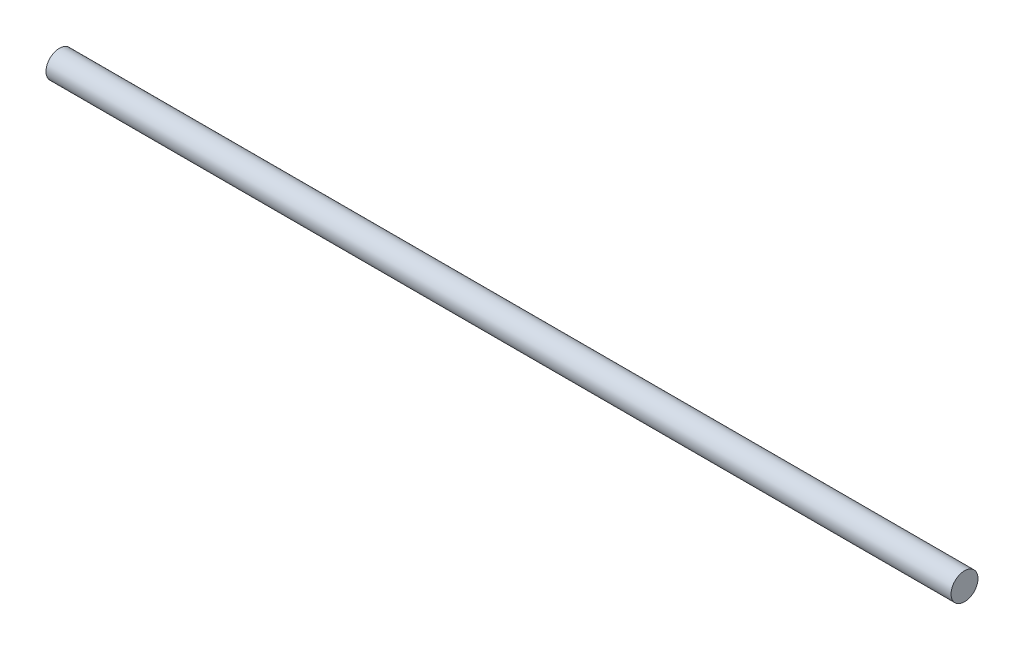
ISO-10303-21;
HEADER;
FILE_DESCRIPTION(('STEP AP214'),'2;1');
FILE_NAME('part.step','',(''),(''),'','','');
FILE_SCHEMA(('AUTOMOTIVE_DESIGN { 1 0 10303 214 1 1 1 1 }'));
ENDSEC;
DATA;
#1=APPLICATION_CONTEXT('core data for automotive mechanical design processes');
#2=APPLICATION_PROTOCOL_DEFINITION('international standard','automotive_design',2000,#1);
#3=PRODUCT_CONTEXT('',#1,'mechanical');
#4=PRODUCT('Part','Part','',(#3));
#5=PRODUCT_RELATED_PRODUCT_CATEGORY('part','',(#4));
#6=PRODUCT_DEFINITION_FORMATION('','',#4);
#7=PRODUCT_DEFINITION_CONTEXT('part definition',#1,'design');
#8=PRODUCT_DEFINITION('design','',#6,#7);
#9=PRODUCT_DEFINITION_SHAPE('','',#8);
#10=(LENGTH_UNIT() NAMED_UNIT(*) SI_UNIT(.MILLI.,.METRE.));
#11=(NAMED_UNIT(*) PLANE_ANGLE_UNIT() SI_UNIT($,.RADIAN.));
#12=(NAMED_UNIT(*) SI_UNIT($,.STERADIAN.) SOLID_ANGLE_UNIT());
#13=UNCERTAINTY_MEASURE_WITH_UNIT(LENGTH_MEASURE(1.E-05),#10,'distance_accuracy_value','');
#14=(GEOMETRIC_REPRESENTATION_CONTEXT(3) GLOBAL_UNCERTAINTY_ASSIGNED_CONTEXT((#13)) GLOBAL_UNIT_ASSIGNED_CONTEXT((#10,
#11,#12)) REPRESENTATION_CONTEXT('',''));
#15=CARTESIAN_POINT('',(0.,0.,0.));
#16=DIRECTION('',(0.,0.,1.));
#17=DIRECTION('',(1.,0.,0.));
#18=AXIS2_PLACEMENT_3D('',#15,#16,#17);
#19=CARTESIAN_POINT('',(215.,0.,0.));
#20=DIRECTION('',(-1.,0.,0.));
#21=DIRECTION('',(0.,0.,1.));
#22=AXIS2_PLACEMENT_3D('',#19,#20,#21);
#23=CYLINDRICAL_SURFACE('',#22,3.2);
#24=CARTESIAN_POINT('',(215.,0.,0.));
#25=DIRECTION('',(1.,0.,0.));
#26=DIRECTION('',(0.,0.,-1.));
#27=AXIS2_PLACEMENT_3D('',#24,#25,#26);
#28=CIRCLE('',#27,3.2);
#29=CARTESIAN_POINT('',(215.,0.,-3.2));
#30=VERTEX_POINT('',#29);
#31=EDGE_CURVE('E10',#30,#30,#28,.T.);
#32=ORIENTED_EDGE('',*,*,#31,.F.);
#33=EDGE_LOOP('',(#32));
#34=FACE_BOUND('',#33,.T.);
#35=CARTESIAN_POINT('',(0.,0.,0.));
#36=DIRECTION('',(1.,0.,0.));
#37=DIRECTION('',(0.,0.,-1.));
#38=AXIS2_PLACEMENT_3D('',#35,#36,#37);
#39=CIRCLE('',#38,3.2);
#40=CARTESIAN_POINT('',(0.,0.,-3.2));
#41=VERTEX_POINT('',#40);
#42=EDGE_CURVE('E35',#41,#41,#39,.T.);
#43=ORIENTED_EDGE('',*,*,#42,.T.);
#44=EDGE_LOOP('',(#43));
#45=FACE_BOUND('',#44,.T.);
#46=ADVANCED_FACE('F32',(#34,#45),#23,.T.);
#47=CARTESIAN_POINT('',(215.,0.,0.));
#48=DIRECTION('',(1.,0.,0.));
#49=DIRECTION('',(0.,0.,-1.));
#50=AXIS2_PLACEMENT_3D('',#47,#48,#49);
#51=PLANE('',#50);
#52=ORIENTED_EDGE('',*,*,#31,.T.);
#53=EDGE_LOOP('',(#52));
#54=FACE_BOUND('',#53,.T.);
#55=ADVANCED_FACE('F47',(#54),#51,.T.);
#56=CARTESIAN_POINT('',(0.,0.,0.));
#57=DIRECTION('',(1.,0.,0.));
#58=DIRECTION('',(0.,0.,-1.));
#59=AXIS2_PLACEMENT_3D('',#56,#57,#58);
#60=PLANE('',#59);
#61=ORIENTED_EDGE('',*,*,#42,.F.);
#62=EDGE_LOOP('',(#61));
#63=FACE_BOUND('',#62,.T.);
#64=ADVANCED_FACE('F45',(#63),#60,.F.);
#65=CLOSED_SHELL('',(#46,#55,#64));
#66=MANIFOLD_SOLID_BREP('B2',#65);
#67=ADVANCED_BREP_SHAPE_REPRESENTATION('',(#18,#66),#14);
#68=SHAPE_DEFINITION_REPRESENTATION(#9,#67);
ENDSEC;
END-ISO-10303-21;
